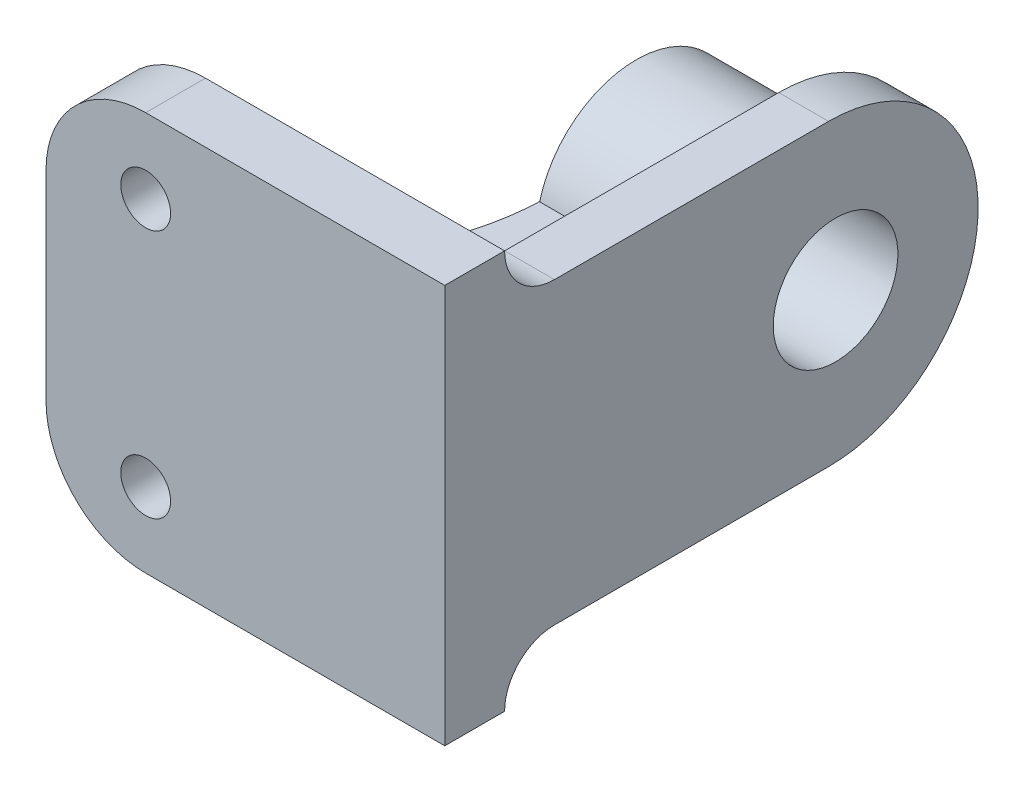
ISO-10303-21;
HEADER;
FILE_DESCRIPTION(('STEP AP214'),'2;1');
FILE_NAME('part.step','',(''),(''),'','','');
FILE_SCHEMA(('AUTOMOTIVE_DESIGN { 1 0 10303 214 1 1 1 1 }'));
ENDSEC;
DATA;
#1=APPLICATION_CONTEXT('core data for automotive mechanical design processes');
#2=APPLICATION_PROTOCOL_DEFINITION('international standard','automotive_design',2000,#1);
#3=PRODUCT_CONTEXT('',#1,'mechanical');
#4=PRODUCT('Part','Part','',(#3));
#5=PRODUCT_RELATED_PRODUCT_CATEGORY('part','',(#4));
#6=PRODUCT_DEFINITION_FORMATION('','',#4);
#7=PRODUCT_DEFINITION_CONTEXT('part definition',#1,'design');
#8=PRODUCT_DEFINITION('design','',#6,#7);
#9=PRODUCT_DEFINITION_SHAPE('','',#8);
#10=(LENGTH_UNIT() NAMED_UNIT(*) SI_UNIT(.MILLI.,.METRE.));
#11=(NAMED_UNIT(*) PLANE_ANGLE_UNIT() SI_UNIT($,.RADIAN.));
#12=(NAMED_UNIT(*) SI_UNIT($,.STERADIAN.) SOLID_ANGLE_UNIT());
#13=UNCERTAINTY_MEASURE_WITH_UNIT(LENGTH_MEASURE(1.E-05),#10,'distance_accuracy_value','');
#14=(GEOMETRIC_REPRESENTATION_CONTEXT(3) GLOBAL_UNCERTAINTY_ASSIGNED_CONTEXT((#13)) GLOBAL_UNIT_ASSIGNED_CONTEXT((#10,
#11,#12)) REPRESENTATION_CONTEXT('',''));
#15=CARTESIAN_POINT('',(0.,0.,0.));
#16=DIRECTION('',(0.,0.,1.));
#17=DIRECTION('',(1.,0.,0.));
#18=AXIS2_PLACEMENT_3D('',#15,#16,#17);
#19=CARTESIAN_POINT('',(20.,60.,0.));
#20=DIRECTION('',(0.,0.,1.));
#21=DIRECTION('',(1.,0.,0.));
#22=AXIS2_PLACEMENT_3D('',#19,#20,#21);
#23=PLANE('',#22);
#24=CARTESIAN_POINT('',(20.,15.,0.));
#25=DIRECTION('',(0.,0.,1.));
#26=DIRECTION('',(1.,0.,0.));
#27=AXIS2_PLACEMENT_3D('',#24,#25,#26);
#28=CIRCLE('',#27,5.);
#29=CARTESIAN_POINT('',(25.,15.,0.));
#30=VERTEX_POINT('',#29);
#31=EDGE_CURVE('E232',#30,#30,#28,.F.);
#32=ORIENTED_EDGE('',*,*,#31,.F.);
#33=EDGE_LOOP('',(#32));
#34=FACE_BOUND('',#33,.T.);
#35=DIRECTION('',(1.,0.,0.));
#36=VECTOR('',#35,1.);
#37=CARTESIAN_POINT('',(70.,35.,0.));
#38=LINE('',#37,#36);
#39=CARTESIAN_POINT('',(0.,35.,0.));
#40=VERTEX_POINT('',#39);
#41=CARTESIAN_POINT('',(70.,35.,0.));
#42=VERTEX_POINT('',#41);
#43=EDGE_CURVE('E286',#40,#42,#38,.T.);
#44=ORIENTED_EDGE('',*,*,#43,.T.);
#45=DIRECTION('',(0.,-1.,0.));
#46=VECTOR('',#45,1.);
#47=CARTESIAN_POINT('',(70.,0.,0.));
#48=LINE('',#47,#46);
#49=CARTESIAN_POINT('',(70.,0.,0.));
#50=VERTEX_POINT('',#49);
#51=EDGE_CURVE('E212',#42,#50,#48,.T.);
#52=ORIENTED_EDGE('',*,*,#51,.T.);
#53=DIRECTION('',(1.,0.,0.));
#54=VECTOR('',#53,1.);
#55=CARTESIAN_POINT('',(20.,0.,0.));
#56=LINE('',#55,#54);
#57=CARTESIAN_POINT('',(20.,0.,0.));
#58=VERTEX_POINT('',#57);
#59=EDGE_CURVE('E140',#58,#50,#56,.T.);
#60=ORIENTED_EDGE('',*,*,#59,.F.);
#61=CARTESIAN_POINT('',(20.,20.,0.));
#62=DIRECTION('',(0.,0.,1.));
#63=DIRECTION('',(1.,0.,0.));
#64=AXIS2_PLACEMENT_3D('',#61,#62,#63);
#65=CIRCLE('',#64,20.);
#66=CARTESIAN_POINT('',(0.,20.,0.));
#67=VERTEX_POINT('',#66);
#68=EDGE_CURVE('E86',#67,#58,#65,.T.);
#69=ORIENTED_EDGE('',*,*,#68,.F.);
#70=DIRECTION('',(0.,-1.,0.));
#71=VECTOR('',#70,1.);
#72=CARTESIAN_POINT('',(0.,20.,0.));
#73=LINE('',#72,#71);
#74=EDGE_CURVE('E121',#40,#67,#73,.T.);
#75=ORIENTED_EDGE('',*,*,#74,.F.);
#76=EDGE_LOOP('',(#44,#52,#60,#69,#75));
#77=FACE_BOUND('',#76,.T.);
#78=ADVANCED_FACE('F37',(#34,#77),#23,.F.);
#79=CARTESIAN_POINT('',(20.,65.,0.));
#80=DIRECTION('',(0.,0.,1.));
#81=DIRECTION('',(1.,0.,0.));
#82=AXIS2_PLACEMENT_3D('',#79,#80,#81);
#83=CIRCLE('',#82,5.);
#84=CARTESIAN_POINT('',(25.,65.,0.));
#85=VERTEX_POINT('',#84);
#86=EDGE_CURVE('E247',#85,#85,#83,.F.);
#87=ORIENTED_EDGE('',*,*,#86,.F.);
#88=EDGE_LOOP('',(#87));
#89=FACE_BOUND('',#88,.T.);
#90=CARTESIAN_POINT('',(70.,80.,0.));
#91=VERTEX_POINT('',#90);
#92=CARTESIAN_POINT('',(70.,45.,0.));
#93=VERTEX_POINT('',#92);
#94=EDGE_CURVE('E213',#91,#93,#48,.T.);
#95=ORIENTED_EDGE('',*,*,#94,.T.);
#96=DIRECTION('',(1.,0.,0.));
#97=VECTOR('',#96,1.);
#98=CARTESIAN_POINT('',(70.,45.,0.));
#99=LINE('',#98,#97);
#100=CARTESIAN_POINT('',(0.,45.,0.));
#101=VERTEX_POINT('',#100);
#102=EDGE_CURVE('E269',#101,#93,#99,.T.);
#103=ORIENTED_EDGE('',*,*,#102,.F.);
#104=CARTESIAN_POINT('',(0.,60.,0.));
#105=VERTEX_POINT('',#104);
#106=EDGE_CURVE('E137',#105,#101,#73,.T.);
#107=ORIENTED_EDGE('',*,*,#106,.F.);
#108=CARTESIAN_POINT('',(20.,60.,0.));
#109=DIRECTION('',(0.,0.,1.));
#110=DIRECTION('',(1.,0.,0.));
#111=AXIS2_PLACEMENT_3D('',#108,#109,#110);
#112=CIRCLE('',#111,20.);
#113=CARTESIAN_POINT('',(20.,80.,0.));
#114=VERTEX_POINT('',#113);
#115=EDGE_CURVE('E134',#114,#105,#112,.T.);
#116=ORIENTED_EDGE('',*,*,#115,.F.);
#117=DIRECTION('',(-1.,0.,0.));
#118=VECTOR('',#117,1.);
#119=CARTESIAN_POINT('',(20.,80.,0.));
#120=LINE('',#119,#118);
#121=EDGE_CURVE('E135',#91,#114,#120,.T.);
#122=ORIENTED_EDGE('',*,*,#121,.F.);
#123=EDGE_LOOP('',(#95,#103,#107,#116,#122));
#124=FACE_BOUND('',#123,.T.);
#125=ADVANCED_FACE('F267',(#89,#124),#23,.F.);
#126=CARTESIAN_POINT('',(80.,0.,12.));
#127=DIRECTION('',(-1.,0.,0.));
#128=DIRECTION('',(0.,0.,1.));
#129=AXIS2_PLACEMENT_3D('',#126,#127,#128);
#130=PLANE('',#129);
#131=CARTESIAN_POINT('',(80.,40.,-66.3988855289936));
#132=DIRECTION('',(-1.,0.,0.));
#133=DIRECTION('',(0.,0.,1.));
#134=AXIS2_PLACEMENT_3D('',#131,#132,#133);
#135=CIRCLE('',#134,12.5);
#136=CARTESIAN_POINT('',(80.,40.,-53.8988855289936));
#137=VERTEX_POINT('',#136);
#138=EDGE_CURVE('E191',#137,#137,#135,.F.);
#139=ORIENTED_EDGE('',*,*,#138,.F.);
#140=EDGE_LOOP('',(#139));
#141=FACE_BOUND('',#140,.T.);
#142=DIRECTION('',(0.,0.,-1.));
#143=VECTOR('',#142,1.);
#144=CARTESIAN_POINT('',(80.,0.,12.));
#145=LINE('',#144,#143);
#146=CARTESIAN_POINT('',(80.,0.,12.));
#147=VERTEX_POINT('',#146);
#148=CARTESIAN_POINT('',(80.,0.,0.));
#149=VERTEX_POINT('',#148);
#150=EDGE_CURVE('E127',#147,#149,#145,.T.);
#151=ORIENTED_EDGE('',*,*,#150,.T.);
#152=CARTESIAN_POINT('',(80.,0.,-10.));
#153=DIRECTION('',(-1.,0.,0.));
#154=DIRECTION('',(0.,0.,-1.));
#155=AXIS2_PLACEMENT_3D('',#152,#153,#154);
#156=CIRCLE('',#155,10.);
#157=CARTESIAN_POINT('',(80.,10.,-10.));
#158=VERTEX_POINT('',#157);
#159=EDGE_CURVE('E195',#149,#158,#156,.T.);
#160=ORIENTED_EDGE('',*,*,#159,.T.);
#161=DIRECTION('',(0.,0.,-1.));
#162=VECTOR('',#161,1.);
#163=CARTESIAN_POINT('',(80.,10.,-65.));
#164=LINE('',#163,#162);
#165=CARTESIAN_POINT('',(80.,10.,-65.));
#166=VERTEX_POINT('',#165);
#167=EDGE_CURVE('E219',#158,#166,#164,.T.);
#168=ORIENTED_EDGE('',*,*,#167,.T.);
#169=CARTESIAN_POINT('',(80.,40.,-65.));
#170=DIRECTION('',(1.,0.,0.));
#171=DIRECTION('',(0.,0.,1.));
#172=AXIS2_PLACEMENT_3D('',#169,#170,#171);
#173=CIRCLE('',#172,30.);
#174=CARTESIAN_POINT('',(80.,70.,-65.));
#175=VERTEX_POINT('',#174);
#176=EDGE_CURVE('E222',#166,#175,#173,.T.);
#177=ORIENTED_EDGE('',*,*,#176,.T.);
#178=DIRECTION('',(0.,0.,1.));
#179=VECTOR('',#178,1.);
#180=CARTESIAN_POINT('',(80.,70.,-9.99999999999999));
#181=LINE('',#180,#179);
#182=CARTESIAN_POINT('',(80.,70.,-9.99999999999999));
#183=VERTEX_POINT('',#182);
#184=EDGE_CURVE('E225',#175,#183,#181,.T.);
#185=ORIENTED_EDGE('',*,*,#184,.T.);
#186=CARTESIAN_POINT('',(80.,80.,-9.99999999999999));
#187=DIRECTION('',(-1.,0.,0.));
#188=DIRECTION('',(0.,0.,-1.));
#189=AXIS2_PLACEMENT_3D('',#186,#187,#188);
#190=CIRCLE('',#189,9.99999999999999);
#191=CARTESIAN_POINT('',(80.,80.,0.));
#192=VERTEX_POINT('',#191);
#193=EDGE_CURVE('E200',#183,#192,#190,.T.);
#194=ORIENTED_EDGE('',*,*,#193,.T.);
#195=DIRECTION('',(0.,0.,-1.));
#196=VECTOR('',#195,1.);
#197=CARTESIAN_POINT('',(80.,80.,12.));
#198=LINE('',#197,#196);
#199=CARTESIAN_POINT('',(80.,80.,12.));
#200=VERTEX_POINT('',#199);
#201=EDGE_CURVE('E151',#200,#192,#198,.T.);
#202=ORIENTED_EDGE('',*,*,#201,.F.);
#203=DIRECTION('',(0.,1.,0.));
#204=VECTOR('',#203,1.);
#205=CARTESIAN_POINT('',(80.,0.,12.));
#206=LINE('',#205,#204);
#207=EDGE_CURVE('E143',#147,#200,#206,.T.);
#208=ORIENTED_EDGE('',*,*,#207,.F.);
#209=EDGE_LOOP('',(#151,#160,#168,#177,#185,#194,#202,#208));
#210=FACE_BOUND('',#209,.T.);
#211=ADVANCED_FACE('F39',(#141,#210),#130,.F.);
#212=CARTESIAN_POINT('',(20.,80.,12.));
#213=DIRECTION('',(0.,-1.,0.));
#214=DIRECTION('',(0.,0.,-1.));
#215=AXIS2_PLACEMENT_3D('',#212,#213,#214);
#216=PLANE('',#215);
#217=EDGE_CURVE('E131',#192,#91,#120,.T.);
#218=ORIENTED_EDGE('',*,*,#217,.T.);
#219=ORIENTED_EDGE('',*,*,#121,.T.);
#220=DIRECTION('',(0.,0.,-1.));
#221=VECTOR('',#220,1.);
#222=CARTESIAN_POINT('',(20.,80.,12.));
#223=LINE('',#222,#221);
#224=CARTESIAN_POINT('',(20.,80.,12.));
#225=VERTEX_POINT('',#224);
#226=EDGE_CURVE('E148',#225,#114,#223,.T.);
#227=ORIENTED_EDGE('',*,*,#226,.F.);
#228=DIRECTION('',(-1.,0.,0.));
#229=VECTOR('',#228,1.);
#230=CARTESIAN_POINT('',(20.,80.,12.));
#231=LINE('',#230,#229);
#232=EDGE_CURVE('E95',#200,#225,#231,.T.);
#233=ORIENTED_EDGE('',*,*,#232,.F.);
#234=ORIENTED_EDGE('',*,*,#201,.T.);
#235=EDGE_LOOP('',(#218,#219,#227,#233,#234));
#236=FACE_BOUND('',#235,.T.);
#237=ADVANCED_FACE('F258',(#236),#216,.F.);
#238=CARTESIAN_POINT('',(20.,60.,12.));
#239=DIRECTION('',(0.,0.,-1.));
#240=DIRECTION('',(-1.,0.,0.));
#241=AXIS2_PLACEMENT_3D('',#238,#239,#240);
#242=CYLINDRICAL_SURFACE('',#241,20.);
#243=ORIENTED_EDGE('',*,*,#115,.T.);
#244=DIRECTION('',(0.,0.,-1.));
#245=VECTOR('',#244,1.);
#246=CARTESIAN_POINT('',(0.,60.,12.));
#247=LINE('',#246,#245);
#248=CARTESIAN_POINT('',(0.,60.,12.));
#249=VERTEX_POINT('',#248);
#250=EDGE_CURVE('E122',#249,#105,#247,.T.);
#251=ORIENTED_EDGE('',*,*,#250,.F.);
#252=CARTESIAN_POINT('',(20.,60.,12.));
#253=DIRECTION('',(0.,0.,1.));
#254=DIRECTION('',(1.,0.,0.));
#255=AXIS2_PLACEMENT_3D('',#252,#253,#254);
#256=CIRCLE('',#255,20.);
#257=EDGE_CURVE('E111',#225,#249,#256,.T.);
#258=ORIENTED_EDGE('',*,*,#257,.F.);
#259=ORIENTED_EDGE('',*,*,#226,.T.);
#260=EDGE_LOOP('',(#243,#251,#258,#259));
#261=FACE_BOUND('',#260,.T.);
#262=ADVANCED_FACE('F262',(#261),#242,.T.);
#263=CARTESIAN_POINT('',(0.,20.,12.));
#264=DIRECTION('',(1.,0.,0.));
#265=DIRECTION('',(0.,0.,-1.));
#266=AXIS2_PLACEMENT_3D('',#263,#264,#265);
#267=PLANE('',#266);
#268=ORIENTED_EDGE('',*,*,#106,.T.);
#269=DIRECTION('',(0.,-1.,0.));
#270=VECTOR('',#269,1.);
#271=CARTESIAN_POINT('',(0.,45.,0.));
#272=LINE('',#271,#270);
#273=EDGE_CURVE('E182',#101,#40,#272,.T.);
#274=ORIENTED_EDGE('',*,*,#273,.T.);
#275=ORIENTED_EDGE('',*,*,#74,.T.);
#276=DIRECTION('',(0.,0.,-1.));
#277=VECTOR('',#276,1.);
#278=CARTESIAN_POINT('',(0.,20.,12.));
#279=LINE('',#278,#277);
#280=CARTESIAN_POINT('',(0.,20.,12.));
#281=VERTEX_POINT('',#280);
#282=EDGE_CURVE('E116',#281,#67,#279,.T.);
#283=ORIENTED_EDGE('',*,*,#282,.F.);
#284=DIRECTION('',(0.,-1.,0.));
#285=VECTOR('',#284,1.);
#286=CARTESIAN_POINT('',(0.,20.,12.));
#287=LINE('',#286,#285);
#288=EDGE_CURVE('E105',#249,#281,#287,.T.);
#289=ORIENTED_EDGE('',*,*,#288,.F.);
#290=ORIENTED_EDGE('',*,*,#250,.T.);
#291=EDGE_LOOP('',(#268,#274,#275,#283,#289,#290));
#292=FACE_BOUND('',#291,.T.);
#293=ADVANCED_FACE('F118',(#292),#267,.F.);
#294=CARTESIAN_POINT('',(20.,20.,12.));
#295=DIRECTION('',(0.,0.,-1.));
#296=DIRECTION('',(-1.,0.,0.));
#297=AXIS2_PLACEMENT_3D('',#294,#295,#296);
#298=CYLINDRICAL_SURFACE('',#297,20.);
#299=ORIENTED_EDGE('',*,*,#68,.T.);
#300=DIRECTION('',(0.,0.,-1.));
#301=VECTOR('',#300,1.);
#302=CARTESIAN_POINT('',(20.,0.,12.));
#303=LINE('',#302,#301);
#304=CARTESIAN_POINT('',(20.,0.,12.));
#305=VERTEX_POINT('',#304);
#306=EDGE_CURVE('E123',#305,#58,#303,.T.);
#307=ORIENTED_EDGE('',*,*,#306,.F.);
#308=CARTESIAN_POINT('',(20.,20.,12.));
#309=DIRECTION('',(0.,0.,1.));
#310=DIRECTION('',(1.,0.,0.));
#311=AXIS2_PLACEMENT_3D('',#308,#309,#310);
#312=CIRCLE('',#311,20.);
#313=EDGE_CURVE('E109',#281,#305,#312,.T.);
#314=ORIENTED_EDGE('',*,*,#313,.F.);
#315=ORIENTED_EDGE('',*,*,#282,.T.);
#316=EDGE_LOOP('',(#299,#307,#314,#315));
#317=FACE_BOUND('',#316,.T.);
#318=ADVANCED_FACE('F125',(#317),#298,.T.);
#319=CARTESIAN_POINT('',(20.,0.,12.));
#320=DIRECTION('',(0.,1.,0.));
#321=DIRECTION('',(0.,0.,1.));
#322=AXIS2_PLACEMENT_3D('',#319,#320,#321);
#323=PLANE('',#322);
#324=ORIENTED_EDGE('',*,*,#59,.T.);
#325=DIRECTION('',(1.,0.,0.));
#326=VECTOR('',#325,1.);
#327=CARTESIAN_POINT('',(70.,0.,0.));
#328=LINE('',#327,#326);
#329=EDGE_CURVE('E229',#50,#149,#328,.T.);
#330=ORIENTED_EDGE('',*,*,#329,.T.);
#331=ORIENTED_EDGE('',*,*,#150,.F.);
#332=DIRECTION('',(1.,0.,0.));
#333=VECTOR('',#332,1.);
#334=CARTESIAN_POINT('',(20.,0.,12.));
#335=LINE('',#334,#333);
#336=EDGE_CURVE('E61',#305,#147,#335,.T.);
#337=ORIENTED_EDGE('',*,*,#336,.F.);
#338=ORIENTED_EDGE('',*,*,#306,.T.);
#339=EDGE_LOOP('',(#324,#330,#331,#337,#338));
#340=FACE_BOUND('',#339,.T.);
#341=ADVANCED_FACE('F333',(#340),#323,.F.);
#342=CARTESIAN_POINT('',(20.,60.,12.));
#343=DIRECTION('',(0.,0.,1.));
#344=DIRECTION('',(1.,0.,0.));
#345=AXIS2_PLACEMENT_3D('',#342,#343,#344);
#346=PLANE('',#345);
#347=CARTESIAN_POINT('',(20.,65.,12.));
#348=DIRECTION('',(0.,0.,1.));
#349=DIRECTION('',(1.,0.,0.));
#350=AXIS2_PLACEMENT_3D('',#347,#348,#349);
#351=CIRCLE('',#350,5.);
#352=CARTESIAN_POINT('',(25.,65.,12.));
#353=VERTEX_POINT('',#352);
#354=EDGE_CURVE('E244',#353,#353,#351,.T.);
#355=ORIENTED_EDGE('',*,*,#354,.F.);
#356=EDGE_LOOP('',(#355));
#357=FACE_BOUND('',#356,.T.);
#358=CARTESIAN_POINT('',(20.,15.,12.));
#359=DIRECTION('',(0.,0.,1.));
#360=DIRECTION('',(1.,0.,0.));
#361=AXIS2_PLACEMENT_3D('',#358,#359,#360);
#362=CIRCLE('',#361,5.);
#363=CARTESIAN_POINT('',(25.,15.,12.));
#364=VERTEX_POINT('',#363);
#365=EDGE_CURVE('E248',#364,#364,#362,.T.);
#366=ORIENTED_EDGE('',*,*,#365,.F.);
#367=EDGE_LOOP('',(#366));
#368=FACE_BOUND('',#367,.T.);
#369=ORIENTED_EDGE('',*,*,#207,.T.);
#370=ORIENTED_EDGE('',*,*,#232,.T.);
#371=ORIENTED_EDGE('',*,*,#257,.T.);
#372=ORIENTED_EDGE('',*,*,#288,.T.);
#373=ORIENTED_EDGE('',*,*,#313,.T.);
#374=ORIENTED_EDGE('',*,*,#336,.T.);
#375=EDGE_LOOP('',(#369,#370,#371,#372,#373,#374));
#376=FACE_BOUND('',#375,.T.);
#377=ADVANCED_FACE('F107',(#357,#368,#376),#346,.T.);
#378=CARTESIAN_POINT('',(20.,15.,-0.000999999999999265));
#379=DIRECTION('',(0.,0.,1.));
#380=DIRECTION('',(1.,0.,0.));
#381=AXIS2_PLACEMENT_3D('',#378,#379,#380);
#382=CYLINDRICAL_SURFACE('',#381,5.);
#383=ORIENTED_EDGE('',*,*,#365,.T.);
#384=EDGE_LOOP('',(#383));
#385=FACE_BOUND('',#384,.T.);
#386=ORIENTED_EDGE('',*,*,#31,.T.);
#387=EDGE_LOOP('',(#386));
#388=FACE_BOUND('',#387,.T.);
#389=ADVANCED_FACE('F421',(#385,#388),#382,.F.);
#390=CARTESIAN_POINT('',(20.,65.,-0.000999999999999265));
#391=DIRECTION('',(0.,0.,1.));
#392=DIRECTION('',(1.,0.,0.));
#393=AXIS2_PLACEMENT_3D('',#390,#391,#392);
#394=CYLINDRICAL_SURFACE('',#393,5.);
#395=ORIENTED_EDGE('',*,*,#354,.T.);
#396=EDGE_LOOP('',(#395));
#397=FACE_BOUND('',#396,.T.);
#398=ORIENTED_EDGE('',*,*,#86,.T.);
#399=EDGE_LOOP('',(#398));
#400=FACE_BOUND('',#399,.T.);
#401=ADVANCED_FACE('F419',(#397,#400),#394,.F.);
#402=CARTESIAN_POINT('',(70.,0.,-10.));
#403=DIRECTION('',(1.,0.,0.));
#404=DIRECTION('',(0.,0.,-1.));
#405=AXIS2_PLACEMENT_3D('',#402,#403,#404);
#406=CYLINDRICAL_SURFACE('',#405,10.);
#407=ORIENTED_EDGE('',*,*,#159,.F.);
#408=ORIENTED_EDGE('',*,*,#329,.F.);
#409=CARTESIAN_POINT('',(70.,0.,-10.));
#410=DIRECTION('',(-1.,0.,0.));
#411=DIRECTION('',(0.,0.,-1.));
#412=AXIS2_PLACEMENT_3D('',#409,#410,#411);
#413=CIRCLE('',#412,10.);
#414=CARTESIAN_POINT('',(70.,10.,-10.));
#415=VERTEX_POINT('',#414);
#416=EDGE_CURVE('E196',#50,#415,#413,.T.);
#417=ORIENTED_EDGE('',*,*,#416,.T.);
#418=DIRECTION('',(1.,0.,0.));
#419=VECTOR('',#418,1.);
#420=CARTESIAN_POINT('',(70.,10.,-10.));
#421=LINE('',#420,#419);
#422=EDGE_CURVE('E216',#415,#158,#421,.T.);
#423=ORIENTED_EDGE('',*,*,#422,.T.);
#424=EDGE_LOOP('',(#407,#408,#417,#423));
#425=FACE_BOUND('',#424,.T.);
#426=ADVANCED_FACE('F328',(#425),#406,.F.);
#427=CARTESIAN_POINT('',(70.,80.,-9.99999999999999));
#428=DIRECTION('',(1.,0.,0.));
#429=DIRECTION('',(0.,0.,-1.));
#430=AXIS2_PLACEMENT_3D('',#427,#428,#429);
#431=CYLINDRICAL_SURFACE('',#430,9.99999999999999);
#432=ORIENTED_EDGE('',*,*,#193,.F.);
#433=DIRECTION('',(1.,0.,0.));
#434=VECTOR('',#433,1.);
#435=CARTESIAN_POINT('',(70.,70.,-9.99999999999999));
#436=LINE('',#435,#434);
#437=CARTESIAN_POINT('',(70.,70.,-9.99999999999999));
#438=VERTEX_POINT('',#437);
#439=EDGE_CURVE('E233',#438,#183,#436,.T.);
#440=ORIENTED_EDGE('',*,*,#439,.F.);
#441=CARTESIAN_POINT('',(70.,80.,-9.99999999999999));
#442=DIRECTION('',(-1.,0.,0.));
#443=DIRECTION('',(0.,0.,-1.));
#444=AXIS2_PLACEMENT_3D('',#441,#442,#443);
#445=CIRCLE('',#444,9.99999999999999);
#446=EDGE_CURVE('E209',#438,#91,#445,.T.);
#447=ORIENTED_EDGE('',*,*,#446,.T.);
#448=ORIENTED_EDGE('',*,*,#217,.F.);
#449=EDGE_LOOP('',(#432,#440,#447,#448));
#450=FACE_BOUND('',#449,.T.);
#451=ADVANCED_FACE('F337',(#450),#431,.F.);
#452=CARTESIAN_POINT('',(70.,70.,-9.99999999999999));
#453=DIRECTION('',(0.,1.,0.));
#454=DIRECTION('',(0.,0.,1.));
#455=AXIS2_PLACEMENT_3D('',#452,#453,#454);
#456=PLANE('',#455);
#457=ORIENTED_EDGE('',*,*,#184,.F.);
#458=DIRECTION('',(1.,0.,0.));
#459=VECTOR('',#458,1.);
#460=CARTESIAN_POINT('',(70.,70.,-65.));
#461=LINE('',#460,#459);
#462=CARTESIAN_POINT('',(70.,70.,-65.));
#463=VERTEX_POINT('',#462);
#464=EDGE_CURVE('E236',#463,#175,#461,.T.);
#465=ORIENTED_EDGE('',*,*,#464,.F.);
#466=DIRECTION('',(0.,0.,1.));
#467=VECTOR('',#466,1.);
#468=CARTESIAN_POINT('',(70.,70.,-9.99999999999999));
#469=LINE('',#468,#467);
#470=EDGE_CURVE('E206',#463,#438,#469,.T.);
#471=ORIENTED_EDGE('',*,*,#470,.T.);
#472=ORIENTED_EDGE('',*,*,#439,.T.);
#473=EDGE_LOOP('',(#457,#465,#471,#472));
#474=FACE_BOUND('',#473,.T.);
#475=ADVANCED_FACE('F355',(#474),#456,.T.);
#476=CARTESIAN_POINT('',(70.,40.,-65.));
#477=DIRECTION('',(1.,0.,0.));
#478=DIRECTION('',(0.,0.,-1.));
#479=AXIS2_PLACEMENT_3D('',#476,#477,#478);
#480=CYLINDRICAL_SURFACE('',#479,30.);
#481=ORIENTED_EDGE('',*,*,#176,.F.);
#482=DIRECTION('',(1.,0.,0.));
#483=VECTOR('',#482,1.);
#484=CARTESIAN_POINT('',(70.,10.,-65.));
#485=LINE('',#484,#483);
#486=CARTESIAN_POINT('',(70.,10.,-65.));
#487=VERTEX_POINT('',#486);
#488=EDGE_CURVE('E239',#487,#166,#485,.T.);
#489=ORIENTED_EDGE('',*,*,#488,.F.);
#490=CARTESIAN_POINT('',(70.,40.,-65.));
#491=DIRECTION('',(1.,0.,0.));
#492=DIRECTION('',(0.,0.,1.));
#493=AXIS2_PLACEMENT_3D('',#490,#491,#492);
#494=CIRCLE('',#493,30.);
#495=EDGE_CURVE('E203',#487,#463,#494,.T.);
#496=ORIENTED_EDGE('',*,*,#495,.T.);
#497=ORIENTED_EDGE('',*,*,#464,.T.);
#498=EDGE_LOOP('',(#481,#489,#496,#497));
#499=FACE_BOUND('',#498,.T.);
#500=ADVANCED_FACE('F354',(#499),#480,.T.);
#501=CARTESIAN_POINT('',(70.,10.,-65.));
#502=DIRECTION('',(0.,-1.,0.));
#503=DIRECTION('',(0.,0.,-1.));
#504=AXIS2_PLACEMENT_3D('',#501,#502,#503);
#505=PLANE('',#504);
#506=ORIENTED_EDGE('',*,*,#167,.F.);
#507=ORIENTED_EDGE('',*,*,#422,.F.);
#508=DIRECTION('',(0.,0.,-1.));
#509=VECTOR('',#508,1.);
#510=CARTESIAN_POINT('',(70.,10.,-65.));
#511=LINE('',#510,#509);
#512=EDGE_CURVE('E199',#415,#487,#511,.T.);
#513=ORIENTED_EDGE('',*,*,#512,.T.);
#514=ORIENTED_EDGE('',*,*,#488,.T.);
#515=EDGE_LOOP('',(#506,#507,#513,#514));
#516=FACE_BOUND('',#515,.T.);
#517=ADVANCED_FACE('F351',(#516),#505,.T.);
#518=CARTESIAN_POINT('',(70.,0.,-10.));
#519=DIRECTION('',(1.,0.,0.));
#520=DIRECTION('',(0.,0.,-1.));
#521=AXIS2_PLACEMENT_3D('',#518,#519,#520);
#522=PLANE('',#521);
#523=CARTESIAN_POINT('',(70.,40.,-66.3988855289936));
#524=DIRECTION('',(1.,0.,0.));
#525=DIRECTION('',(0.,0.,-1.));
#526=AXIS2_PLACEMENT_3D('',#523,#524,#525);
#527=CIRCLE('',#526,20.);
#528=CARTESIAN_POINT('',(70.,45.,-47.0339687979565));
#529=VERTEX_POINT('',#528);
#530=CARTESIAN_POINT('',(70.,35.,-47.0339687979565));
#531=VERTEX_POINT('',#530);
#532=EDGE_CURVE('E153',#529,#531,#527,.F.);
#533=ORIENTED_EDGE('',*,*,#532,.F.);
#534=DIRECTION('',(0.,0.,-1.));
#535=VECTOR('',#534,1.);
#536=CARTESIAN_POINT('',(70.,45.,-48.2192977953905));
#537=LINE('',#536,#535);
#538=EDGE_CURVE('E278',#93,#529,#537,.T.);
#539=ORIENTED_EDGE('',*,*,#538,.F.);
#540=ORIENTED_EDGE('',*,*,#94,.F.);
#541=ORIENTED_EDGE('',*,*,#446,.F.);
#542=ORIENTED_EDGE('',*,*,#470,.F.);
#543=ORIENTED_EDGE('',*,*,#495,.F.);
#544=ORIENTED_EDGE('',*,*,#512,.F.);
#545=ORIENTED_EDGE('',*,*,#416,.F.);
#546=ORIENTED_EDGE('',*,*,#51,.F.);
#547=DIRECTION('',(0.,0.,-1.));
#548=VECTOR('',#547,1.);
#549=CARTESIAN_POINT('',(70.,35.,-48.2192977953905));
#550=LINE('',#549,#548);
#551=EDGE_CURVE('E282',#42,#531,#550,.T.);
#552=ORIENTED_EDGE('',*,*,#551,.T.);
#553=EDGE_LOOP('',(#533,#539,#540,#541,#542,#543,#544,#545,#546,#552));
#554=FACE_BOUND('',#553,.T.);
#555=ADVANCED_FACE('F341',(#554),#522,.F.);
#556=CARTESIAN_POINT('',(40.,40.,-66.3988855289936));
#557=DIRECTION('',(1.,0.,0.));
#558=DIRECTION('',(0.,0.,-1.));
#559=AXIS2_PLACEMENT_3D('',#556,#557,#558);
#560=CYLINDRICAL_SURFACE('',#559,20.);
#561=CARTESIAN_POINT('',(40.,40.,-66.3988855289936));
#562=DIRECTION('',(-1.,0.,0.));
#563=DIRECTION('',(0.,0.,1.));
#564=AXIS2_PLACEMENT_3D('',#561,#562,#563);
#565=CIRCLE('',#564,20.);
#566=CARTESIAN_POINT('',(40.,45.,-47.0339687979565));
#567=VERTEX_POINT('',#566);
#568=CARTESIAN_POINT('',(40.,35.,-47.0339687979565));
#569=VERTEX_POINT('',#568);
#570=EDGE_CURVE('E166',#567,#569,#565,.T.);
#571=ORIENTED_EDGE('',*,*,#570,.F.);
#572=DIRECTION('',(1.,0.,0.));
#573=VECTOR('',#572,1.);
#574=CARTESIAN_POINT('',(40.,45.,-47.0339687979565));
#575=LINE('',#574,#573);
#576=EDGE_CURVE('E181',#567,#529,#575,.T.);
#577=ORIENTED_EDGE('',*,*,#576,.T.);
#578=ORIENTED_EDGE('',*,*,#532,.T.);
#579=DIRECTION('',(1.,0.,0.));
#580=VECTOR('',#579,1.);
#581=CARTESIAN_POINT('',(40.,35.,-47.0339687979565));
#582=LINE('',#581,#580);
#583=EDGE_CURVE('E172',#569,#531,#582,.T.);
#584=ORIENTED_EDGE('',*,*,#583,.F.);
#585=EDGE_LOOP('',(#571,#577,#578,#584));
#586=FACE_BOUND('',#585,.T.);
#587=ADVANCED_FACE('F177',(#586),#560,.T.);
#588=CARTESIAN_POINT('',(40.,40.,-66.3988855289936));
#589=DIRECTION('',(-1.,0.,0.));
#590=DIRECTION('',(0.,0.,1.));
#591=AXIS2_PLACEMENT_3D('',#588,#589,#590);
#592=PLANE('',#591);
#593=DIRECTION('',(0.,0.,-1.));
#594=VECTOR('',#593,1.);
#595=CARTESIAN_POINT('',(40.,45.,-66.3988855289936));
#596=LINE('',#595,#594);
#597=CARTESIAN_POINT('',(40.,45.,-48.2192977953905));
#598=VERTEX_POINT('',#597);
#599=EDGE_CURVE('E11',#567,#598,#596,.T.);
#600=ORIENTED_EDGE('',*,*,#599,.F.);
#601=ORIENTED_EDGE('',*,*,#570,.T.);
#602=DIRECTION('',(0.,0.,-1.));
#603=VECTOR('',#602,1.);
#604=CARTESIAN_POINT('',(40.,35.,-66.3988855289936));
#605=LINE('',#604,#603);
#606=CARTESIAN_POINT('',(40.,35.,-48.2192977953905));
#607=VERTEX_POINT('',#606);
#608=EDGE_CURVE('E45',#569,#607,#605,.T.);
#609=ORIENTED_EDGE('',*,*,#608,.T.);
#610=DIRECTION('',(0.,-1.,0.));
#611=VECTOR('',#610,1.);
#612=CARTESIAN_POINT('',(40.,45.,-48.2192977953905));
#613=LINE('',#612,#611);
#614=EDGE_CURVE('E163',#598,#607,#613,.T.);
#615=ORIENTED_EDGE('',*,*,#614,.F.);
#616=EDGE_LOOP('',(#600,#601,#609,#615));
#617=FACE_BOUND('',#616,.T.);
#618=CARTESIAN_POINT('',(40.,40.,-66.3988855289936));
#619=DIRECTION('',(-1.,0.,0.));
#620=DIRECTION('',(0.,0.,1.));
#621=AXIS2_PLACEMENT_3D('',#618,#619,#620);
#622=CIRCLE('',#621,12.5);
#623=CARTESIAN_POINT('',(40.,40.,-53.8988855289936));
#624=VERTEX_POINT('',#623);
#625=EDGE_CURVE('E184',#624,#624,#622,.T.);
#626=ORIENTED_EDGE('',*,*,#625,.F.);
#627=EDGE_LOOP('',(#626));
#628=FACE_BOUND('',#627,.T.);
#629=ADVANCED_FACE('F160',(#617,#628),#592,.T.);
#630=CARTESIAN_POINT('',(80.001,40.,-66.3988855289936));
#631=DIRECTION('',(-1.,0.,0.));
#632=DIRECTION('',(0.,0.,1.));
#633=AXIS2_PLACEMENT_3D('',#630,#631,#632);
#634=CYLINDRICAL_SURFACE('',#633,12.5);
#635=ORIENTED_EDGE('',*,*,#625,.T.);
#636=EDGE_LOOP('',(#635));
#637=FACE_BOUND('',#636,.T.);
#638=ORIENTED_EDGE('',*,*,#138,.T.);
#639=EDGE_LOOP('',(#638));
#640=FACE_BOUND('',#639,.T.);
#641=ADVANCED_FACE('F393',(#637,#640),#634,.F.);
#642=CARTESIAN_POINT('',(-9.99404424505979,45.,-48.9910101919504));
#643=DIRECTION('',(0.,1.,0.));
#644=DIRECTION('',(0.,0.,1.));
#645=AXIS2_PLACEMENT_3D('',#642,#643,#644);
#646=PLANE('',#645);
#647=ORIENTED_EDGE('',*,*,#576,.F.);
#648=ORIENTED_EDGE('',*,*,#599,.T.);
#649=CARTESIAN_POINT('',(-9.99404424505979,45.,-48.9910101919504));
#650=DIRECTION('',(0.,-1.,0.));
#651=DIRECTION('',(0.,0.,1.));
#652=AXIS2_PLACEMENT_3D('',#649,#650,#651);
#653=CIRCLE('',#652,50.);
#654=EDGE_CURVE('E279',#598,#101,#653,.T.);
#655=ORIENTED_EDGE('',*,*,#654,.T.);
#656=ORIENTED_EDGE('',*,*,#102,.T.);
#657=ORIENTED_EDGE('',*,*,#538,.T.);
#658=EDGE_LOOP('',(#647,#648,#655,#656,#657));
#659=FACE_BOUND('',#658,.T.);
#660=ADVANCED_FACE('F296',(#659),#646,.T.);
#661=CARTESIAN_POINT('',(-9.99404424505979,35.,-48.9910101919504));
#662=DIRECTION('',(0.,1.,0.));
#663=DIRECTION('',(0.,0.,1.));
#664=AXIS2_PLACEMENT_3D('',#661,#662,#663);
#665=PLANE('',#664);
#666=ORIENTED_EDGE('',*,*,#608,.F.);
#667=ORIENTED_EDGE('',*,*,#583,.T.);
#668=ORIENTED_EDGE('',*,*,#551,.F.);
#669=ORIENTED_EDGE('',*,*,#43,.F.);
#670=CARTESIAN_POINT('',(-9.99404424505979,35.,-48.9910101919504));
#671=DIRECTION('',(0.,-1.,0.));
#672=DIRECTION('',(0.,0.,1.));
#673=AXIS2_PLACEMENT_3D('',#670,#671,#672);
#674=CIRCLE('',#673,50.);
#675=EDGE_CURVE('E52',#607,#40,#674,.T.);
#676=ORIENTED_EDGE('',*,*,#675,.F.);
#677=EDGE_LOOP('',(#666,#667,#668,#669,#676));
#678=FACE_BOUND('',#677,.T.);
#679=ADVANCED_FACE('F169',(#678),#665,.F.);
#680=CARTESIAN_POINT('',(-9.99404424505979,45.,-48.9910101919504));
#681=DIRECTION('',(0.,-1.,0.));
#682=DIRECTION('',(0.,0.,-1.));
#683=AXIS2_PLACEMENT_3D('',#680,#681,#682);
#684=CYLINDRICAL_SURFACE('',#683,50.);
#685=ORIENTED_EDGE('',*,*,#675,.T.);
#686=ORIENTED_EDGE('',*,*,#273,.F.);
#687=ORIENTED_EDGE('',*,*,#654,.F.);
#688=ORIENTED_EDGE('',*,*,#614,.T.);
#689=EDGE_LOOP('',(#685,#686,#687,#688));
#690=FACE_BOUND('',#689,.T.);
#691=ADVANCED_FACE('F291',(#690),#684,.F.);
#692=CLOSED_SHELL('',(#78,#125,#211,#237,#262,#293,#318,#341,#377,#389,#401,#426,#451,#475,#500,
#517,#555,#587,#629,#641,#660,#679,#691));
#693=MANIFOLD_SOLID_BREP('B2',#692);
#694=ADVANCED_BREP_SHAPE_REPRESENTATION('',(#18,#693),#14);
#695=SHAPE_DEFINITION_REPRESENTATION(#9,#694);
ENDSEC;
END-ISO-10303-21;
